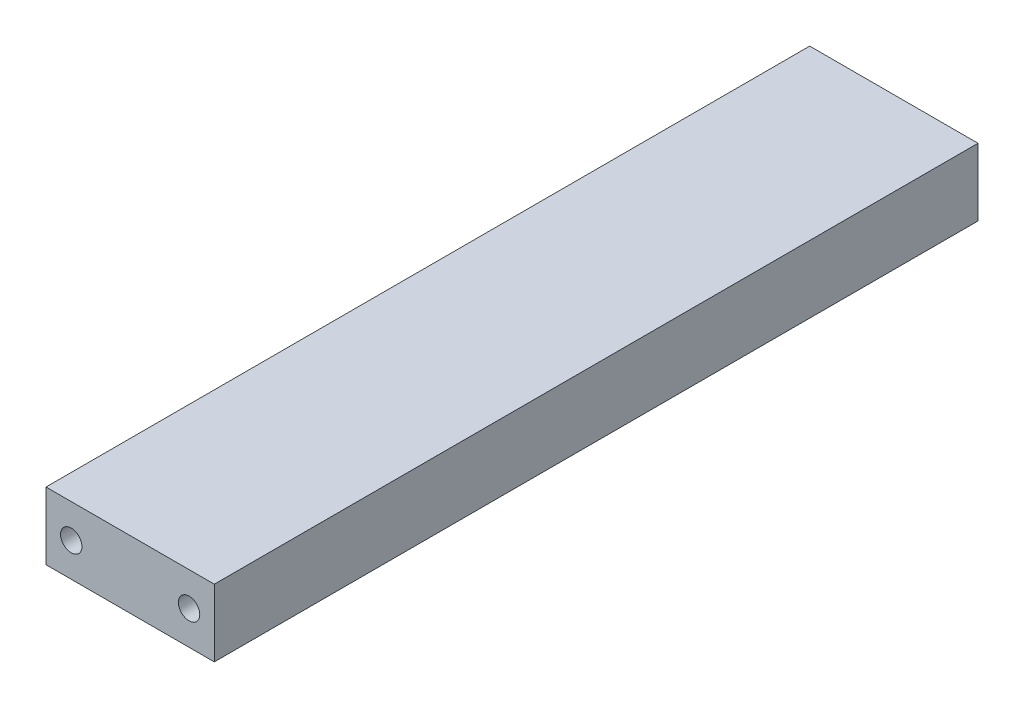
ISO-10303-21;
HEADER;
FILE_DESCRIPTION(('STEP AP214'),'2;1');
FILE_NAME('part.step','',(''),(''),'','','');
FILE_SCHEMA(('AUTOMOTIVE_DESIGN { 1 0 10303 214 1 1 1 1 }'));
ENDSEC;
DATA;
#1=APPLICATION_CONTEXT('core data for automotive mechanical design processes');
#2=APPLICATION_PROTOCOL_DEFINITION('international standard','automotive_design',2000,#1);
#3=PRODUCT_CONTEXT('',#1,'mechanical');
#4=PRODUCT('Part','Part','',(#3));
#5=PRODUCT_RELATED_PRODUCT_CATEGORY('part','',(#4));
#6=PRODUCT_DEFINITION_FORMATION('','',#4);
#7=PRODUCT_DEFINITION_CONTEXT('part definition',#1,'design');
#8=PRODUCT_DEFINITION('design','',#6,#7);
#9=PRODUCT_DEFINITION_SHAPE('','',#8);
#10=(LENGTH_UNIT() NAMED_UNIT(*) SI_UNIT(.MILLI.,.METRE.));
#11=(NAMED_UNIT(*) PLANE_ANGLE_UNIT() SI_UNIT($,.RADIAN.));
#12=(NAMED_UNIT(*) SI_UNIT($,.STERADIAN.) SOLID_ANGLE_UNIT());
#13=UNCERTAINTY_MEASURE_WITH_UNIT(LENGTH_MEASURE(1.E-05),#10,'distance_accuracy_value','');
#14=(GEOMETRIC_REPRESENTATION_CONTEXT(3) GLOBAL_UNCERTAINTY_ASSIGNED_CONTEXT((#13)) GLOBAL_UNIT_ASSIGNED_CONTEXT((#10,
#11,#12)) REPRESENTATION_CONTEXT('',''));
#15=CARTESIAN_POINT('',(0.,0.,0.));
#16=DIRECTION('',(0.,0.,1.));
#17=DIRECTION('',(1.,0.,0.));
#18=AXIS2_PLACEMENT_3D('',#15,#16,#17);
#19=CARTESIAN_POINT('',(0.,0.,0.));
#20=DIRECTION('',(0.,0.,1.));
#21=DIRECTION('',(1.,0.,0.));
#22=AXIS2_PLACEMENT_3D('',#19,#20,#21);
#23=PLANE('',#22);
#24=CARTESIAN_POINT('',(-11.1125,0.,0.));
#25=DIRECTION('',(0.,0.,-1.));
#26=DIRECTION('',(-1.,0.,0.));
#27=AXIS2_PLACEMENT_3D('',#24,#25,#26);
#28=CIRCLE('',#27,2.01929999999999);
#29=CARTESIAN_POINT('',(-13.1318,0.,0.));
#30=VERTEX_POINT('',#29);
#31=EDGE_CURVE('E130',#30,#30,#28,.T.);
#32=ORIENTED_EDGE('',*,*,#31,.F.);
#33=EDGE_LOOP('',(#32));
#34=FACE_BOUND('',#33,.T.);
#35=CARTESIAN_POINT('',(11.1125,0.,0.));
#36=DIRECTION('',(0.,0.,-1.));
#37=DIRECTION('',(-1.,0.,0.));
#38=AXIS2_PLACEMENT_3D('',#35,#36,#37);
#39=CIRCLE('',#38,2.01929999999999);
#40=CARTESIAN_POINT('',(9.09320000000001,0.,0.));
#41=VERTEX_POINT('',#40);
#42=EDGE_CURVE('E124',#41,#41,#39,.T.);
#43=ORIENTED_EDGE('',*,*,#42,.F.);
#44=EDGE_LOOP('',(#43));
#45=FACE_BOUND('',#44,.T.);
#46=DIRECTION('',(0.,1.,0.));
#47=VECTOR('',#46,1.);
#48=CARTESIAN_POINT('',(15.875,6.35,0.));
#49=LINE('',#48,#47);
#50=CARTESIAN_POINT('',(15.875,-6.35,0.));
#51=VERTEX_POINT('',#50);
#52=CARTESIAN_POINT('',(15.875,6.35,0.));
#53=VERTEX_POINT('',#52);
#54=EDGE_CURVE('E86',#51,#53,#49,.T.);
#55=ORIENTED_EDGE('',*,*,#54,.F.);
#56=DIRECTION('',(1.,0.,0.));
#57=VECTOR('',#56,1.);
#58=CARTESIAN_POINT('',(-15.875,-6.35,0.));
#59=LINE('',#58,#57);
#60=CARTESIAN_POINT('',(-15.875,-6.35,0.));
#61=VERTEX_POINT('',#60);
#62=EDGE_CURVE('E101',#61,#51,#59,.T.);
#63=ORIENTED_EDGE('',*,*,#62,.F.);
#64=DIRECTION('',(0.,-1.,0.));
#65=VECTOR('',#64,1.);
#66=CARTESIAN_POINT('',(-15.875,6.35,0.));
#67=LINE('',#66,#65);
#68=CARTESIAN_POINT('',(-15.875,6.35,0.));
#69=VERTEX_POINT('',#68);
#70=EDGE_CURVE('E88',#69,#61,#67,.T.);
#71=ORIENTED_EDGE('',*,*,#70,.F.);
#72=DIRECTION('',(-1.,0.,0.));
#73=VECTOR('',#72,1.);
#74=CARTESIAN_POINT('',(-15.875,6.35,0.));
#75=LINE('',#74,#73);
#76=EDGE_CURVE('E78',#53,#69,#75,.T.);
#77=ORIENTED_EDGE('',*,*,#76,.F.);
#78=EDGE_LOOP('',(#55,#63,#71,#77));
#79=FACE_BOUND('',#78,.T.);
#80=ADVANCED_FACE('F36',(#34,#45,#79),#23,.F.);
#81=CARTESIAN_POINT('',(-15.875,-6.35,183.261557684713));
#82=DIRECTION('',(0.,1.,0.));
#83=DIRECTION('',(0.,0.,1.));
#84=AXIS2_PLACEMENT_3D('',#81,#82,#83);
#85=PLANE('',#84);
#86=DIRECTION('',(0.,0.,-1.));
#87=VECTOR('',#86,1.);
#88=CARTESIAN_POINT('',(15.875,-6.35,183.261557684713));
#89=LINE('',#88,#87);
#90=CARTESIAN_POINT('',(15.875,-6.35,144.065761159409));
#91=VERTEX_POINT('',#90);
#92=EDGE_CURVE('E91',#91,#51,#89,.T.);
#93=ORIENTED_EDGE('',*,*,#92,.F.);
#94=DIRECTION('',(-1.,0.,0.));
#95=VECTOR('',#94,1.);
#96=CARTESIAN_POINT('',(-15.875,-6.35,144.065761159409));
#97=LINE('',#96,#95);
#98=CARTESIAN_POINT('',(-15.875,-6.35,144.065761159409));
#99=VERTEX_POINT('',#98);
#100=EDGE_CURVE('E40',#91,#99,#97,.T.);
#101=ORIENTED_EDGE('',*,*,#100,.T.);
#102=DIRECTION('',(0.,0.,-1.));
#103=VECTOR('',#102,1.);
#104=CARTESIAN_POINT('',(-15.875,-6.35,183.261557684713));
#105=LINE('',#104,#103);
#106=EDGE_CURVE('E104',#99,#61,#105,.T.);
#107=ORIENTED_EDGE('',*,*,#106,.T.);
#108=ORIENTED_EDGE('',*,*,#62,.T.);
#109=EDGE_LOOP('',(#93,#101,#107,#108));
#110=FACE_BOUND('',#109,.T.);
#111=ADVANCED_FACE('F138',(#110),#85,.F.);
#112=CARTESIAN_POINT('',(-15.875,6.35,183.261557684713));
#113=DIRECTION('',(1.,0.,0.));
#114=DIRECTION('',(0.,0.,-1.));
#115=AXIS2_PLACEMENT_3D('',#112,#113,#114);
#116=PLANE('',#115);
#117=ORIENTED_EDGE('',*,*,#106,.F.);
#118=DIRECTION('',(0.,1.,0.));
#119=VECTOR('',#118,1.);
#120=CARTESIAN_POINT('',(-15.875,6.35,144.065761159409));
#121=LINE('',#120,#119);
#122=CARTESIAN_POINT('',(-15.875,6.35,144.065761159409));
#123=VERTEX_POINT('',#122);
#124=EDGE_CURVE('E110',#99,#123,#121,.T.);
#125=ORIENTED_EDGE('',*,*,#124,.T.);
#126=DIRECTION('',(0.,0.,-1.));
#127=VECTOR('',#126,1.);
#128=CARTESIAN_POINT('',(-15.875,6.35,183.261557684713));
#129=LINE('',#128,#127);
#130=EDGE_CURVE('E82',#123,#69,#129,.T.);
#131=ORIENTED_EDGE('',*,*,#130,.T.);
#132=ORIENTED_EDGE('',*,*,#70,.T.);
#133=EDGE_LOOP('',(#117,#125,#131,#132));
#134=FACE_BOUND('',#133,.T.);
#135=ADVANCED_FACE('F109',(#134),#116,.F.);
#136=CARTESIAN_POINT('',(-15.875,6.35,183.261557684713));
#137=DIRECTION('',(0.,-1.,0.));
#138=DIRECTION('',(0.,0.,-1.));
#139=AXIS2_PLACEMENT_3D('',#136,#137,#138);
#140=PLANE('',#139);
#141=ORIENTED_EDGE('',*,*,#130,.F.);
#142=DIRECTION('',(1.,0.,0.));
#143=VECTOR('',#142,1.);
#144=CARTESIAN_POINT('',(-15.875,6.35,144.065761159409));
#145=LINE('',#144,#143);
#146=CARTESIAN_POINT('',(15.875,6.35,144.065761159409));
#147=VERTEX_POINT('',#146);
#148=EDGE_CURVE('E45',#123,#147,#145,.T.);
#149=ORIENTED_EDGE('',*,*,#148,.T.);
#150=DIRECTION('',(0.,0.,-1.));
#151=VECTOR('',#150,1.);
#152=CARTESIAN_POINT('',(15.875,6.35,183.261557684713));
#153=LINE('',#152,#151);
#154=EDGE_CURVE('E75',#147,#53,#153,.T.);
#155=ORIENTED_EDGE('',*,*,#154,.T.);
#156=ORIENTED_EDGE('',*,*,#76,.T.);
#157=EDGE_LOOP('',(#141,#149,#155,#156));
#158=FACE_BOUND('',#157,.T.);
#159=ADVANCED_FACE('F77',(#158),#140,.F.);
#160=CARTESIAN_POINT('',(15.875,6.35,183.261557684713));
#161=DIRECTION('',(-1.,0.,0.));
#162=DIRECTION('',(0.,0.,1.));
#163=AXIS2_PLACEMENT_3D('',#160,#161,#162);
#164=PLANE('',#163);
#165=ORIENTED_EDGE('',*,*,#154,.F.);
#166=DIRECTION('',(0.,-1.,0.));
#167=VECTOR('',#166,1.);
#168=CARTESIAN_POINT('',(15.875,6.35,144.065761159409));
#169=LINE('',#168,#167);
#170=EDGE_CURVE('E11',#147,#91,#169,.T.);
#171=ORIENTED_EDGE('',*,*,#170,.T.);
#172=ORIENTED_EDGE('',*,*,#92,.T.);
#173=ORIENTED_EDGE('',*,*,#54,.T.);
#174=EDGE_LOOP('',(#165,#171,#172,#173));
#175=FACE_BOUND('',#174,.T.);
#176=ADVANCED_FACE('F38',(#175),#164,.F.);
#177=CARTESIAN_POINT('',(28.575,-60.9829537850522,144.065761159409));
#178=DIRECTION('',(0.,0.,-1.));
#179=DIRECTION('',(-1.,0.,0.));
#180=AXIS2_PLACEMENT_3D('',#177,#178,#179);
#181=PLANE('',#180);
#182=CARTESIAN_POINT('',(-11.1125,0.,144.065761159409));
#183=DIRECTION('',(0.,0.,1.));
#184=DIRECTION('',(1.,0.,0.));
#185=AXIS2_PLACEMENT_3D('',#182,#183,#184);
#186=CIRCLE('',#185,2.01929999999999);
#187=CARTESIAN_POINT('',(-9.09320000000001,0.,144.065761159409));
#188=VERTEX_POINT('',#187);
#189=EDGE_CURVE('E118',#188,#188,#186,.T.);
#190=ORIENTED_EDGE('',*,*,#189,.F.);
#191=EDGE_LOOP('',(#190));
#192=FACE_BOUND('',#191,.T.);
#193=CARTESIAN_POINT('',(11.1125,0.,144.065761159409));
#194=DIRECTION('',(0.,0.,1.));
#195=DIRECTION('',(1.,0.,0.));
#196=AXIS2_PLACEMENT_3D('',#193,#194,#195);
#197=CIRCLE('',#196,2.01929999999999);
#198=CARTESIAN_POINT('',(13.1318,0.,144.065761159409));
#199=VERTEX_POINT('',#198);
#200=EDGE_CURVE('E96',#199,#199,#197,.T.);
#201=ORIENTED_EDGE('',*,*,#200,.F.);
#202=EDGE_LOOP('',(#201));
#203=FACE_BOUND('',#202,.T.);
#204=ORIENTED_EDGE('',*,*,#148,.F.);
#205=ORIENTED_EDGE('',*,*,#124,.F.);
#206=ORIENTED_EDGE('',*,*,#100,.F.);
#207=ORIENTED_EDGE('',*,*,#170,.F.);
#208=EDGE_LOOP('',(#204,#205,#206,#207));
#209=FACE_BOUND('',#208,.T.);
#210=ADVANCED_FACE('F174',(#192,#203,#209),#181,.F.);
#211=CARTESIAN_POINT('',(11.1125,0.,132.035761159409));
#212=DIRECTION('',(0.,0.,-1.));
#213=DIRECTION('',(-1.,0.,0.));
#214=AXIS2_PLACEMENT_3D('',#211,#212,#213);
#215=PLANE('',#214);
#216=CARTESIAN_POINT('',(11.1125,0.,132.035761159409));
#217=DIRECTION('',(0.,0.,1.));
#218=DIRECTION('',(1.,0.,0.));
#219=AXIS2_PLACEMENT_3D('',#216,#217,#218);
#220=CIRCLE('',#219,2.01929999999999);
#221=CARTESIAN_POINT('',(13.1318,0.,132.035761159409));
#222=VERTEX_POINT('',#221);
#223=EDGE_CURVE('E93',#222,#222,#220,.T.);
#224=ORIENTED_EDGE('',*,*,#223,.T.);
#225=EDGE_LOOP('',(#224));
#226=FACE_BOUND('',#225,.T.);
#227=ADVANCED_FACE('F170',(#226),#215,.F.);
#228=CARTESIAN_POINT('',(11.1125,0.,144.065761159409));
#229=DIRECTION('',(0.,0.,1.));
#230=DIRECTION('',(1.,0.,0.));
#231=AXIS2_PLACEMENT_3D('',#228,#229,#230);
#232=CYLINDRICAL_SURFACE('',#231,2.01929999999999);
#233=ORIENTED_EDGE('',*,*,#223,.F.);
#234=EDGE_LOOP('',(#233));
#235=FACE_BOUND('',#234,.T.);
#236=ORIENTED_EDGE('',*,*,#200,.T.);
#237=EDGE_LOOP('',(#236));
#238=FACE_BOUND('',#237,.T.);
#239=ADVANCED_FACE('F166',(#235,#238),#232,.F.);
#240=CARTESIAN_POINT('',(-11.1125,0.,132.035761159409));
#241=DIRECTION('',(0.,0.,-1.));
#242=DIRECTION('',(-1.,0.,0.));
#243=AXIS2_PLACEMENT_3D('',#240,#241,#242);
#244=PLANE('',#243);
#245=CARTESIAN_POINT('',(-11.1125,0.,132.035761159409));
#246=DIRECTION('',(0.,0.,1.));
#247=DIRECTION('',(1.,0.,0.));
#248=AXIS2_PLACEMENT_3D('',#245,#246,#247);
#249=CIRCLE('',#248,2.01929999999999);
#250=CARTESIAN_POINT('',(-9.09320000000001,0.,132.035761159409));
#251=VERTEX_POINT('',#250);
#252=EDGE_CURVE('E115',#251,#251,#249,.T.);
#253=ORIENTED_EDGE('',*,*,#252,.T.);
#254=EDGE_LOOP('',(#253));
#255=FACE_BOUND('',#254,.T.);
#256=ADVANCED_FACE('F162',(#255),#244,.F.);
#257=CARTESIAN_POINT('',(-11.1125,0.,144.065761159409));
#258=DIRECTION('',(0.,0.,1.));
#259=DIRECTION('',(1.,0.,0.));
#260=AXIS2_PLACEMENT_3D('',#257,#258,#259);
#261=CYLINDRICAL_SURFACE('',#260,2.01929999999999);
#262=ORIENTED_EDGE('',*,*,#252,.F.);
#263=EDGE_LOOP('',(#262));
#264=FACE_BOUND('',#263,.T.);
#265=ORIENTED_EDGE('',*,*,#189,.T.);
#266=EDGE_LOOP('',(#265));
#267=FACE_BOUND('',#266,.T.);
#268=ADVANCED_FACE('F154',(#264,#267),#261,.F.);
#269=CARTESIAN_POINT('',(11.1125,0.,12.03));
#270=DIRECTION('',(0.,0.,1.));
#271=DIRECTION('',(1.,0.,0.));
#272=AXIS2_PLACEMENT_3D('',#269,#270,#271);
#273=PLANE('',#272);
#274=CARTESIAN_POINT('',(11.1125,0.,12.03));
#275=DIRECTION('',(0.,0.,-1.));
#276=DIRECTION('',(-1.,0.,0.));
#277=AXIS2_PLACEMENT_3D('',#274,#275,#276);
#278=CIRCLE('',#277,2.01929999999999);
#279=CARTESIAN_POINT('',(9.09320000000001,0.,12.03));
#280=VERTEX_POINT('',#279);
#281=EDGE_CURVE('E121',#280,#280,#278,.T.);
#282=ORIENTED_EDGE('',*,*,#281,.T.);
#283=EDGE_LOOP('',(#282));
#284=FACE_BOUND('',#283,.T.);
#285=ADVANCED_FACE('F145',(#284),#273,.F.);
#286=CARTESIAN_POINT('',(11.1125,0.,0.));
#287=DIRECTION('',(0.,0.,-1.));
#288=DIRECTION('',(-1.,0.,0.));
#289=AXIS2_PLACEMENT_3D('',#286,#287,#288);
#290=CYLINDRICAL_SURFACE('',#289,2.01929999999999);
#291=ORIENTED_EDGE('',*,*,#281,.F.);
#292=EDGE_LOOP('',(#291));
#293=FACE_BOUND('',#292,.T.);
#294=ORIENTED_EDGE('',*,*,#42,.T.);
#295=EDGE_LOOP('',(#294));
#296=FACE_BOUND('',#295,.T.);
#297=ADVANCED_FACE('F142',(#293,#296),#290,.F.);
#298=CARTESIAN_POINT('',(-11.1125,0.,12.03));
#299=DIRECTION('',(0.,0.,1.));
#300=DIRECTION('',(1.,0.,0.));
#301=AXIS2_PLACEMENT_3D('',#298,#299,#300);
#302=PLANE('',#301);
#303=CARTESIAN_POINT('',(-11.1125,0.,12.03));
#304=DIRECTION('',(0.,0.,-1.));
#305=DIRECTION('',(-1.,0.,0.));
#306=AXIS2_PLACEMENT_3D('',#303,#304,#305);
#307=CIRCLE('',#306,2.01929999999999);
#308=CARTESIAN_POINT('',(-13.1318,0.,12.03));
#309=VERTEX_POINT('',#308);
#310=EDGE_CURVE('E127',#309,#309,#307,.T.);
#311=ORIENTED_EDGE('',*,*,#310,.T.);
#312=EDGE_LOOP('',(#311));
#313=FACE_BOUND('',#312,.T.);
#314=ADVANCED_FACE('F144',(#313),#302,.F.);
#315=CARTESIAN_POINT('',(-11.1125,0.,0.));
#316=DIRECTION('',(0.,0.,-1.));
#317=DIRECTION('',(-1.,0.,0.));
#318=AXIS2_PLACEMENT_3D('',#315,#316,#317);
#319=CYLINDRICAL_SURFACE('',#318,2.01929999999999);
#320=ORIENTED_EDGE('',*,*,#310,.F.);
#321=EDGE_LOOP('',(#320));
#322=FACE_BOUND('',#321,.T.);
#323=ORIENTED_EDGE('',*,*,#31,.T.);
#324=EDGE_LOOP('',(#323));
#325=FACE_BOUND('',#324,.T.);
#326=ADVANCED_FACE('F134',(#322,#325),#319,.F.);
#327=CLOSED_SHELL('',(#80,#111,#135,#159,#176,#210,#227,#239,#256,#268,#285,#297,#314,#326));
#328=MANIFOLD_SOLID_BREP('B2',#327);
#329=ADVANCED_BREP_SHAPE_REPRESENTATION('',(#18,#328),#14);
#330=SHAPE_DEFINITION_REPRESENTATION(#9,#329);
ENDSEC;
END-ISO-10303-21;
